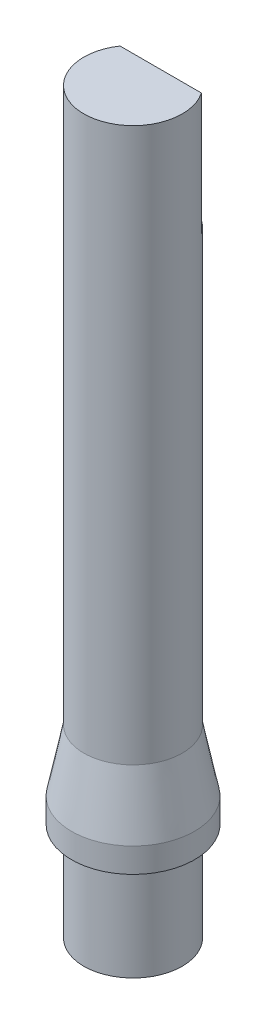
ISO-10303-21;
HEADER;
FILE_DESCRIPTION(('STEP AP214'),'2;1');
FILE_NAME('part.step','',(''),(''),'','','');
FILE_SCHEMA(('AUTOMOTIVE_DESIGN { 1 0 10303 214 1 1 1 1 }'));
ENDSEC;
DATA;
#1=APPLICATION_CONTEXT('core data for automotive mechanical design processes');
#2=APPLICATION_PROTOCOL_DEFINITION('international standard','automotive_design',2000,#1);
#3=PRODUCT_CONTEXT('',#1,'mechanical');
#4=PRODUCT('Part','Part','',(#3));
#5=PRODUCT_RELATED_PRODUCT_CATEGORY('part','',(#4));
#6=PRODUCT_DEFINITION_FORMATION('','',#4);
#7=PRODUCT_DEFINITION_CONTEXT('part definition',#1,'design');
#8=PRODUCT_DEFINITION('design','',#6,#7);
#9=PRODUCT_DEFINITION_SHAPE('','',#8);
#10=(LENGTH_UNIT() NAMED_UNIT(*) SI_UNIT(.MILLI.,.METRE.));
#11=(NAMED_UNIT(*) PLANE_ANGLE_UNIT() SI_UNIT($,.RADIAN.));
#12=(NAMED_UNIT(*) SI_UNIT($,.STERADIAN.) SOLID_ANGLE_UNIT());
#13=UNCERTAINTY_MEASURE_WITH_UNIT(LENGTH_MEASURE(1.E-05),#10,'distance_accuracy_value','');
#14=(GEOMETRIC_REPRESENTATION_CONTEXT(3) GLOBAL_UNCERTAINTY_ASSIGNED_CONTEXT((#13)) GLOBAL_UNIT_ASSIGNED_CONTEXT((#10,
#11,#12)) REPRESENTATION_CONTEXT('',''));
#15=CARTESIAN_POINT('',(0.,0.,0.));
#16=DIRECTION('',(0.,0.,1.));
#17=DIRECTION('',(1.,0.,0.));
#18=AXIS2_PLACEMENT_3D('',#15,#16,#17);
#19=CARTESIAN_POINT('',(0.,60.,0.));
#20=DIRECTION('',(0.,-1.,0.));
#21=DIRECTION('',(0.,0.,-1.));
#22=AXIS2_PLACEMENT_3D('',#19,#20,#21);
#23=CYLINDRICAL_SURFACE('',#22,4.);
#24=CARTESIAN_POINT('',(0.,60.,0.));
#25=DIRECTION('',(0.,1.,0.));
#26=DIRECTION('',(0.,0.,1.));
#27=AXIS2_PLACEMENT_3D('',#24,#25,#26);
#28=CIRCLE('',#27,4.);
#29=CARTESIAN_POINT('',(-3.30718913883074,60.,-2.25));
#30=VERTEX_POINT('',#29);
#31=CARTESIAN_POINT('',(3.30718913883074,60.,-2.25));
#32=VERTEX_POINT('',#31);
#33=EDGE_CURVE('E40',#30,#32,#28,.T.);
#34=ORIENTED_EDGE('',*,*,#33,.F.);
#35=DIRECTION('',(0.,1.,0.));
#36=VECTOR('',#35,1.);
#37=CARTESIAN_POINT('',(-3.30718913883074,50.,-2.25));
#38=LINE('',#37,#36);
#39=CARTESIAN_POINT('',(-3.30718913883074,50.,-2.25));
#40=VERTEX_POINT('',#39);
#41=EDGE_CURVE('E47',#40,#30,#38,.T.);
#42=ORIENTED_EDGE('',*,*,#41,.F.);
#43=CARTESIAN_POINT('',(0.,50.,0.));
#44=DIRECTION('',(0.,1.,0.));
#45=DIRECTION('',(0.,0.,1.));
#46=AXIS2_PLACEMENT_3D('',#43,#44,#45);
#47=CIRCLE('',#46,4.);
#48=CARTESIAN_POINT('',(3.30718913883074,50.,-2.25));
#49=VERTEX_POINT('',#48);
#50=EDGE_CURVE('E63',#49,#40,#47,.T.);
#51=ORIENTED_EDGE('',*,*,#50,.F.);
#52=DIRECTION('',(0.,1.,0.));
#53=VECTOR('',#52,1.);
#54=CARTESIAN_POINT('',(3.30718913883074,50.,-2.25));
#55=LINE('',#54,#53);
#56=EDGE_CURVE('E53',#49,#32,#55,.T.);
#57=ORIENTED_EDGE('',*,*,#56,.T.);
#58=EDGE_LOOP('',(#34,#42,#51,#57));
#59=FACE_BOUND('',#58,.T.);
#60=CARTESIAN_POINT('',(0.,15.,0.));
#61=DIRECTION('',(0.,-1.,0.));
#62=DIRECTION('',(0.,0.,-1.));
#63=AXIS2_PLACEMENT_3D('',#60,#61,#62);
#64=CIRCLE('',#63,4.);
#65=CARTESIAN_POINT('',(0.,15.,-4.));
#66=VERTEX_POINT('',#65);
#67=EDGE_CURVE('E11',#66,#66,#64,.F.);
#68=ORIENTED_EDGE('',*,*,#67,.T.);
#69=EDGE_LOOP('',(#68));
#70=FACE_BOUND('',#69,.T.);
#71=ADVANCED_FACE('F32',(#59,#70),#23,.T.);
#72=CARTESIAN_POINT('',(0.,60.,0.));
#73=DIRECTION('',(0.,1.,0.));
#74=DIRECTION('',(0.,0.,1.));
#75=AXIS2_PLACEMENT_3D('',#72,#73,#74);
#76=PLANE('',#75);
#77=DIRECTION('',(1.,0.,0.));
#78=VECTOR('',#77,1.);
#79=CARTESIAN_POINT('',(-3.30718913883074,60.,-2.25));
#80=LINE('',#79,#78);
#81=EDGE_CURVE('E58',#30,#32,#80,.T.);
#82=ORIENTED_EDGE('',*,*,#81,.F.);
#83=ORIENTED_EDGE('',*,*,#33,.T.);
#84=EDGE_LOOP('',(#82,#83));
#85=FACE_BOUND('',#84,.T.);
#86=ADVANCED_FACE('F70',(#85),#76,.T.);
#87=CARTESIAN_POINT('',(0.,10.,0.));
#88=DIRECTION('',(0.,-1.,0.));
#89=DIRECTION('',(0.,0.,-1.));
#90=AXIS2_PLACEMENT_3D('',#87,#88,#89);
#91=CYLINDRICAL_SURFACE('',#90,5.);
#92=CARTESIAN_POINT('',(0.,10.,0.));
#93=DIRECTION('',(0.,-1.,0.));
#94=DIRECTION('',(0.,0.,-1.));
#95=AXIS2_PLACEMENT_3D('',#92,#93,#94);
#96=CIRCLE('',#95,5.);
#97=CARTESIAN_POINT('',(0.,10.,-5.));
#98=VERTEX_POINT('',#97);
#99=EDGE_CURVE('E79',#98,#98,#96,.T.);
#100=ORIENTED_EDGE('',*,*,#99,.T.);
#101=EDGE_LOOP('',(#100));
#102=FACE_BOUND('',#101,.T.);
#103=CARTESIAN_POINT('',(0.,8.,0.));
#104=DIRECTION('',(0.,-1.,0.));
#105=DIRECTION('',(0.,0.,-1.));
#106=AXIS2_PLACEMENT_3D('',#103,#104,#105);
#107=CIRCLE('',#106,5.);
#108=CARTESIAN_POINT('',(0.,8.,-5.));
#109=VERTEX_POINT('',#108);
#110=EDGE_CURVE('E68',#109,#109,#107,.T.);
#111=ORIENTED_EDGE('',*,*,#110,.F.);
#112=EDGE_LOOP('',(#111));
#113=FACE_BOUND('',#112,.T.);
#114=ADVANCED_FACE('F103',(#102,#113),#91,.T.);
#115=CARTESIAN_POINT('',(0.,8.,0.));
#116=DIRECTION('',(0.,-1.,0.));
#117=DIRECTION('',(0.,0.,-1.));
#118=AXIS2_PLACEMENT_3D('',#115,#116,#117);
#119=PLANE('',#118);
#120=CARTESIAN_POINT('',(0.,8.,0.));
#121=DIRECTION('',(0.,-1.,0.));
#122=DIRECTION('',(0.,0.,-1.));
#123=AXIS2_PLACEMENT_3D('',#120,#121,#122);
#124=CIRCLE('',#123,4.);
#125=CARTESIAN_POINT('',(0.,8.,-4.));
#126=VERTEX_POINT('',#125);
#127=EDGE_CURVE('E74',#126,#126,#124,.T.);
#128=ORIENTED_EDGE('',*,*,#127,.F.);
#129=EDGE_LOOP('',(#128));
#130=FACE_BOUND('',#129,.T.);
#131=ORIENTED_EDGE('',*,*,#110,.T.);
#132=EDGE_LOOP('',(#131));
#133=FACE_BOUND('',#132,.T.);
#134=ADVANCED_FACE('F113',(#130,#133),#119,.T.);
#135=CARTESIAN_POINT('',(0.,0.,0.));
#136=DIRECTION('',(0.,1.,0.));
#137=DIRECTION('',(0.,0.,1.));
#138=AXIS2_PLACEMENT_3D('',#135,#136,#137);
#139=PLANE('',#138);
#140=CARTESIAN_POINT('',(0.,0.,0.));
#141=DIRECTION('',(0.,1.,0.));
#142=DIRECTION('',(0.,0.,1.));
#143=AXIS2_PLACEMENT_3D('',#140,#141,#142);
#144=CIRCLE('',#143,4.);
#145=CARTESIAN_POINT('',(0.,0.,4.));
#146=VERTEX_POINT('',#145);
#147=EDGE_CURVE('E71',#146,#146,#144,.T.);
#148=ORIENTED_EDGE('',*,*,#147,.F.);
#149=EDGE_LOOP('',(#148));
#150=FACE_BOUND('',#149,.T.);
#151=ADVANCED_FACE('F107',(#150),#139,.F.);
#152=ORIENTED_EDGE('',*,*,#127,.T.);
#153=EDGE_LOOP('',(#152));
#154=FACE_BOUND('',#153,.T.);
#155=ORIENTED_EDGE('',*,*,#147,.T.);
#156=EDGE_LOOP('',(#155));
#157=FACE_BOUND('',#156,.T.);
#158=ADVANCED_FACE('F99',(#154,#157),#23,.T.);
#159=CARTESIAN_POINT('',(0.,10.,0.));
#160=DIRECTION('',(0.,-1.,0.));
#161=DIRECTION('',(0.,0.,-1.));
#162=AXIS2_PLACEMENT_3D('',#159,#160,#161);
#163=CONICAL_SURFACE('',#162,5.00000000000001,0.197395559849884);
#164=ORIENTED_EDGE('',*,*,#67,.F.);
#165=EDGE_LOOP('',(#164));
#166=FACE_BOUND('',#165,.T.);
#167=ORIENTED_EDGE('',*,*,#99,.F.);
#168=EDGE_LOOP('',(#167));
#169=FACE_BOUND('',#168,.T.);
#170=ADVANCED_FACE('F34',(#166,#169),#163,.T.);
#171=CARTESIAN_POINT('',(-3.30718913883074,50.,-2.25));
#172=DIRECTION('',(0.,0.,1.));
#173=DIRECTION('',(1.,0.,0.));
#174=AXIS2_PLACEMENT_3D('',#171,#172,#173);
#175=PLANE('',#174);
#176=ORIENTED_EDGE('',*,*,#81,.T.);
#177=ORIENTED_EDGE('',*,*,#56,.F.);
#178=DIRECTION('',(1.,0.,0.));
#179=VECTOR('',#178,1.);
#180=CARTESIAN_POINT('',(-3.30718913883074,50.,-2.25));
#181=LINE('',#180,#179);
#182=EDGE_CURVE('E87',#40,#49,#181,.T.);
#183=ORIENTED_EDGE('',*,*,#182,.F.);
#184=ORIENTED_EDGE('',*,*,#41,.T.);
#185=EDGE_LOOP('',(#176,#177,#183,#184));
#186=FACE_BOUND('',#185,.T.);
#187=ADVANCED_FACE('F59',(#186),#175,.F.);
#188=CARTESIAN_POINT('',(0.,50.,0.));
#189=DIRECTION('',(0.,1.,0.));
#190=DIRECTION('',(0.,0.,1.));
#191=AXIS2_PLACEMENT_3D('',#188,#189,#190);
#192=PLANE('',#191);
#193=ORIENTED_EDGE('',*,*,#50,.T.);
#194=ORIENTED_EDGE('',*,*,#182,.T.);
#195=EDGE_LOOP('',(#193,#194));
#196=FACE_BOUND('',#195,.T.);
#197=ADVANCED_FACE('F91',(#196),#192,.T.);
#198=CLOSED_SHELL('',(#71,#86,#114,#134,#151,#158,#170,#187,#197));
#199=MANIFOLD_SOLID_BREP('B2',#198);
#200=ADVANCED_BREP_SHAPE_REPRESENTATION('',(#18,#199),#14);
#201=SHAPE_DEFINITION_REPRESENTATION(#9,#200);
ENDSEC;
END-ISO-10303-21;
